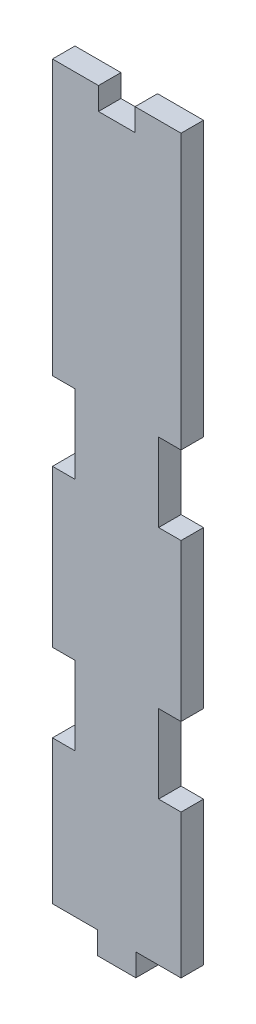
ISO-10303-21;
HEADER;
FILE_DESCRIPTION(('STEP AP214'),'2;1');
FILE_NAME('part.step','',(''),(''),'','','');
FILE_SCHEMA(('AUTOMOTIVE_DESIGN { 1 0 10303 214 1 1 1 1 }'));
ENDSEC;
DATA;
#1=APPLICATION_CONTEXT('core data for automotive mechanical design processes');
#2=APPLICATION_PROTOCOL_DEFINITION('international standard','automotive_design',2000,#1);
#3=PRODUCT_CONTEXT('',#1,'mechanical');
#4=PRODUCT('Part','Part','',(#3));
#5=PRODUCT_RELATED_PRODUCT_CATEGORY('part','',(#4));
#6=PRODUCT_DEFINITION_FORMATION('','',#4);
#7=PRODUCT_DEFINITION_CONTEXT('part definition',#1,'design');
#8=PRODUCT_DEFINITION('design','',#6,#7);
#9=PRODUCT_DEFINITION_SHAPE('','',#8);
#10=(LENGTH_UNIT() NAMED_UNIT(*) SI_UNIT(.MILLI.,.METRE.));
#11=(NAMED_UNIT(*) PLANE_ANGLE_UNIT() SI_UNIT($,.RADIAN.));
#12=(NAMED_UNIT(*) SI_UNIT($,.STERADIAN.) SOLID_ANGLE_UNIT());
#13=UNCERTAINTY_MEASURE_WITH_UNIT(LENGTH_MEASURE(1.E-05),#10,'distance_accuracy_value','');
#14=(GEOMETRIC_REPRESENTATION_CONTEXT(3) GLOBAL_UNCERTAINTY_ASSIGNED_CONTEXT((#13)) GLOBAL_UNIT_ASSIGNED_CONTEXT((#10,
#11,#12)) REPRESENTATION_CONTEXT('',''));
#15=CARTESIAN_POINT('',(0.,0.,0.));
#16=DIRECTION('',(0.,0.,1.));
#17=DIRECTION('',(1.,0.,0.));
#18=AXIS2_PLACEMENT_3D('',#15,#16,#17);
#19=CARTESIAN_POINT('',(12.3,17.5,4.3));
#20=DIRECTION('',(-1.,0.,0.));
#21=DIRECTION('',(0.,-1.,0.));
#22=AXIS2_PLACEMENT_3D('',#19,#20,#21);
#23=PLANE('',#22);
#24=DIRECTION('',(0.,1.,0.));
#25=VECTOR('',#24,1.);
#26=CARTESIAN_POINT('',(12.3,17.5,0.));
#27=LINE('',#26,#25);
#28=CARTESIAN_POINT('',(12.3,17.5,0.));
#29=VERTEX_POINT('',#28);
#30=CARTESIAN_POINT('',(12.3,69.9999999999999,0.));
#31=VERTEX_POINT('',#30);
#32=EDGE_CURVE('E252',#29,#31,#27,.T.);
#33=ORIENTED_EDGE('',*,*,#32,.T.);
#34=DIRECTION('',(0.,0.,-1.));
#35=VECTOR('',#34,1.);
#36=CARTESIAN_POINT('',(12.3,69.9999999999999,4.3));
#37=LINE('',#36,#35);
#38=CARTESIAN_POINT('',(12.3,69.9999999999999,4.3));
#39=VERTEX_POINT('',#38);
#40=EDGE_CURVE('E11',#39,#31,#37,.T.);
#41=ORIENTED_EDGE('',*,*,#40,.F.);
#42=DIRECTION('',(0.,1.,0.));
#43=VECTOR('',#42,1.);
#44=CARTESIAN_POINT('',(12.3,17.5,4.3));
#45=LINE('',#44,#43);
#46=CARTESIAN_POINT('',(12.3,17.5,4.3));
#47=VERTEX_POINT('',#46);
#48=EDGE_CURVE('E306',#47,#39,#45,.T.);
#49=ORIENTED_EDGE('',*,*,#48,.F.);
#50=DIRECTION('',(0.,0.,-1.));
#51=VECTOR('',#50,1.);
#52=CARTESIAN_POINT('',(12.3,17.5,4.3));
#53=LINE('',#52,#51);
#54=EDGE_CURVE('E248',#47,#29,#53,.T.);
#55=ORIENTED_EDGE('',*,*,#54,.T.);
#56=EDGE_LOOP('',(#33,#41,#49,#55));
#57=FACE_BOUND('',#56,.T.);
#58=ADVANCED_FACE('F36',(#57),#23,.F.);
#59=CARTESIAN_POINT('',(3.5,70.,4.3));
#60=DIRECTION('',(0.,-1.,0.));
#61=DIRECTION('',(1.,0.,0.));
#62=AXIS2_PLACEMENT_3D('',#59,#60,#61);
#63=PLANE('',#62);
#64=DIRECTION('',(-1.,0.,0.));
#65=VECTOR('',#64,1.);
#66=CARTESIAN_POINT('',(3.5,70.,0.));
#67=LINE('',#66,#65);
#68=CARTESIAN_POINT('',(3.5,70.,0.));
#69=VERTEX_POINT('',#68);
#70=EDGE_CURVE('E255',#31,#69,#67,.T.);
#71=ORIENTED_EDGE('',*,*,#70,.T.);
#72=DIRECTION('',(0.,0.,-1.));
#73=VECTOR('',#72,1.);
#74=CARTESIAN_POINT('',(3.5,70.,4.3));
#75=LINE('',#74,#73);
#76=CARTESIAN_POINT('',(3.5,70.,4.3));
#77=VERTEX_POINT('',#76);
#78=EDGE_CURVE('E44',#77,#69,#75,.T.);
#79=ORIENTED_EDGE('',*,*,#78,.F.);
#80=DIRECTION('',(-1.,0.,0.));
#81=VECTOR('',#80,1.);
#82=CARTESIAN_POINT('',(3.5,70.,4.3));
#83=LINE('',#82,#81);
#84=EDGE_CURVE('E155',#39,#77,#83,.T.);
#85=ORIENTED_EDGE('',*,*,#84,.F.);
#86=ORIENTED_EDGE('',*,*,#40,.T.);
#87=EDGE_LOOP('',(#71,#79,#85,#86));
#88=FACE_BOUND('',#87,.T.);
#89=ADVANCED_FACE('F464',(#88),#63,.F.);
#90=CARTESIAN_POINT('',(3.5,70.,4.3));
#91=DIRECTION('',(1.,0.,0.));
#92=DIRECTION('',(0.,0.,-1.));
#93=AXIS2_PLACEMENT_3D('',#90,#91,#92);
#94=PLANE('',#93);
#95=DIRECTION('',(0.,-1.,0.));
#96=VECTOR('',#95,1.);
#97=CARTESIAN_POINT('',(3.5,70.,0.));
#98=LINE('',#97,#96);
#99=CARTESIAN_POINT('',(3.5,65.7,0.));
#100=VERTEX_POINT('',#99);
#101=EDGE_CURVE('E257',#69,#100,#98,.T.);
#102=ORIENTED_EDGE('',*,*,#101,.T.);
#103=DIRECTION('',(0.,0.,-1.));
#104=VECTOR('',#103,1.);
#105=CARTESIAN_POINT('',(3.5,65.7,4.3));
#106=LINE('',#105,#104);
#107=CARTESIAN_POINT('',(3.5,65.7,4.3));
#108=VERTEX_POINT('',#107);
#109=EDGE_CURVE('E373',#108,#100,#106,.T.);
#110=ORIENTED_EDGE('',*,*,#109,.F.);
#111=DIRECTION('',(0.,-1.,0.));
#112=VECTOR('',#111,1.);
#113=CARTESIAN_POINT('',(3.5,70.,4.3));
#114=LINE('',#113,#112);
#115=EDGE_CURVE('E381',#77,#108,#114,.T.);
#116=ORIENTED_EDGE('',*,*,#115,.F.);
#117=ORIENTED_EDGE('',*,*,#78,.T.);
#118=EDGE_LOOP('',(#102,#110,#116,#117));
#119=FACE_BOUND('',#118,.T.);
#120=ADVANCED_FACE('F379',(#119),#94,.F.);
#121=CARTESIAN_POINT('',(-3.5,65.7,4.3));
#122=DIRECTION('',(0.,-1.,0.));
#123=DIRECTION('',(0.,0.,-1.));
#124=AXIS2_PLACEMENT_3D('',#121,#122,#123);
#125=PLANE('',#124);
#126=DIRECTION('',(-1.,0.,0.));
#127=VECTOR('',#126,1.);
#128=CARTESIAN_POINT('',(-3.5,65.7,0.));
#129=LINE('',#128,#127);
#130=CARTESIAN_POINT('',(-3.5,65.7,0.));
#131=VERTEX_POINT('',#130);
#132=EDGE_CURVE('E259',#100,#131,#129,.T.);
#133=ORIENTED_EDGE('',*,*,#132,.T.);
#134=DIRECTION('',(0.,0.,-1.));
#135=VECTOR('',#134,1.);
#136=CARTESIAN_POINT('',(-3.5,65.7,4.3));
#137=LINE('',#136,#135);
#138=CARTESIAN_POINT('',(-3.5,65.7,4.3));
#139=VERTEX_POINT('',#138);
#140=EDGE_CURVE('E370',#139,#131,#137,.T.);
#141=ORIENTED_EDGE('',*,*,#140,.F.);
#142=DIRECTION('',(-1.,0.,0.));
#143=VECTOR('',#142,1.);
#144=CARTESIAN_POINT('',(-3.5,65.7,4.3));
#145=LINE('',#144,#143);
#146=EDGE_CURVE('E399',#108,#139,#145,.T.);
#147=ORIENTED_EDGE('',*,*,#146,.F.);
#148=ORIENTED_EDGE('',*,*,#109,.T.);
#149=EDGE_LOOP('',(#133,#141,#147,#148));
#150=FACE_BOUND('',#149,.T.);
#151=ADVANCED_FACE('F390',(#150),#125,.F.);
#152=CARTESIAN_POINT('',(-3.5,70.,4.3));
#153=DIRECTION('',(-1.,0.,0.));
#154=DIRECTION('',(0.,-1.,0.));
#155=AXIS2_PLACEMENT_3D('',#152,#153,#154);
#156=PLANE('',#155);
#157=DIRECTION('',(0.,1.,0.));
#158=VECTOR('',#157,1.);
#159=CARTESIAN_POINT('',(-3.5,70.,0.));
#160=LINE('',#159,#158);
#161=CARTESIAN_POINT('',(-3.5,70.,0.));
#162=VERTEX_POINT('',#161);
#163=EDGE_CURVE('E261',#131,#162,#160,.T.);
#164=ORIENTED_EDGE('',*,*,#163,.T.);
#165=DIRECTION('',(0.,0.,-1.));
#166=VECTOR('',#165,1.);
#167=CARTESIAN_POINT('',(-3.5,70.,4.3));
#168=LINE('',#167,#166);
#169=CARTESIAN_POINT('',(-3.5,70.,4.3));
#170=VERTEX_POINT('',#169);
#171=EDGE_CURVE('E367',#170,#162,#168,.T.);
#172=ORIENTED_EDGE('',*,*,#171,.F.);
#173=DIRECTION('',(0.,1.,0.));
#174=VECTOR('',#173,1.);
#175=CARTESIAN_POINT('',(-3.5,70.,4.3));
#176=LINE('',#175,#174);
#177=EDGE_CURVE('E396',#139,#170,#176,.T.);
#178=ORIENTED_EDGE('',*,*,#177,.F.);
#179=ORIENTED_EDGE('',*,*,#140,.T.);
#180=EDGE_LOOP('',(#164,#172,#178,#179));
#181=FACE_BOUND('',#180,.T.);
#182=ADVANCED_FACE('F394',(#181),#156,.F.);
#183=CARTESIAN_POINT('',(-12.3,69.9999999999999,4.3));
#184=DIRECTION('',(0.,-1.,0.));
#185=DIRECTION('',(1.,0.,0.));
#186=AXIS2_PLACEMENT_3D('',#183,#184,#185);
#187=PLANE('',#186);
#188=DIRECTION('',(-1.,0.,0.));
#189=VECTOR('',#188,1.);
#190=CARTESIAN_POINT('',(-12.3,69.9999999999999,0.));
#191=LINE('',#190,#189);
#192=CARTESIAN_POINT('',(-12.3,69.9999999999999,0.));
#193=VERTEX_POINT('',#192);
#194=EDGE_CURVE('E263',#162,#193,#191,.T.);
#195=ORIENTED_EDGE('',*,*,#194,.T.);
#196=DIRECTION('',(0.,0.,-1.));
#197=VECTOR('',#196,1.);
#198=CARTESIAN_POINT('',(-12.3,69.9999999999999,4.3));
#199=LINE('',#198,#197);
#200=CARTESIAN_POINT('',(-12.3,69.9999999999999,4.3));
#201=VERTEX_POINT('',#200);
#202=EDGE_CURVE('E364',#201,#193,#199,.T.);
#203=ORIENTED_EDGE('',*,*,#202,.F.);
#204=DIRECTION('',(-1.,0.,0.));
#205=VECTOR('',#204,1.);
#206=CARTESIAN_POINT('',(-12.3,69.9999999999999,4.3));
#207=LINE('',#206,#205);
#208=EDGE_CURVE('E398',#170,#201,#207,.T.);
#209=ORIENTED_EDGE('',*,*,#208,.F.);
#210=ORIENTED_EDGE('',*,*,#171,.T.);
#211=EDGE_LOOP('',(#195,#203,#209,#210));
#212=FACE_BOUND('',#211,.T.);
#213=ADVANCED_FACE('F477',(#212),#187,.F.);
#214=CARTESIAN_POINT('',(-12.3,17.5,4.3));
#215=DIRECTION('',(1.,0.,0.));
#216=DIRECTION('',(0.,1.,0.));
#217=AXIS2_PLACEMENT_3D('',#214,#215,#216);
#218=PLANE('',#217);
#219=DIRECTION('',(0.,-1.,0.));
#220=VECTOR('',#219,1.);
#221=CARTESIAN_POINT('',(-12.3,17.5,0.));
#222=LINE('',#221,#220);
#223=CARTESIAN_POINT('',(-12.3,17.5,0.));
#224=VERTEX_POINT('',#223);
#225=EDGE_CURVE('E265',#193,#224,#222,.T.);
#226=ORIENTED_EDGE('',*,*,#225,.T.);
#227=DIRECTION('',(0.,0.,-1.));
#228=VECTOR('',#227,1.);
#229=CARTESIAN_POINT('',(-12.3,17.5,4.3));
#230=LINE('',#229,#228);
#231=CARTESIAN_POINT('',(-12.3,17.5,4.3));
#232=VERTEX_POINT('',#231);
#233=EDGE_CURVE('E361',#232,#224,#230,.T.);
#234=ORIENTED_EDGE('',*,*,#233,.F.);
#235=DIRECTION('',(0.,-1.,0.));
#236=VECTOR('',#235,1.);
#237=CARTESIAN_POINT('',(-12.3,17.5,4.3));
#238=LINE('',#237,#236);
#239=EDGE_CURVE('E401',#201,#232,#238,.T.);
#240=ORIENTED_EDGE('',*,*,#239,.F.);
#241=ORIENTED_EDGE('',*,*,#202,.T.);
#242=EDGE_LOOP('',(#226,#234,#240,#241));
#243=FACE_BOUND('',#242,.T.);
#244=ADVANCED_FACE('F480',(#243),#218,.F.);
#245=CARTESIAN_POINT('',(-12.3,17.5,4.3));
#246=DIRECTION('',(0.,1.,0.));
#247=DIRECTION('',(-1.,0.,0.));
#248=AXIS2_PLACEMENT_3D('',#245,#246,#247);
#249=PLANE('',#248);
#250=DIRECTION('',(1.,0.,0.));
#251=VECTOR('',#250,1.);
#252=CARTESIAN_POINT('',(-12.3,17.5,0.));
#253=LINE('',#252,#251);
#254=CARTESIAN_POINT('',(-8.,17.5,0.));
#255=VERTEX_POINT('',#254);
#256=EDGE_CURVE('E267',#224,#255,#253,.T.);
#257=ORIENTED_EDGE('',*,*,#256,.T.);
#258=DIRECTION('',(0.,0.,-1.));
#259=VECTOR('',#258,1.);
#260=CARTESIAN_POINT('',(-8.,17.5,4.3));
#261=LINE('',#260,#259);
#262=CARTESIAN_POINT('',(-8.,17.5,4.3));
#263=VERTEX_POINT('',#262);
#264=EDGE_CURVE('E358',#263,#255,#261,.T.);
#265=ORIENTED_EDGE('',*,*,#264,.F.);
#266=DIRECTION('',(1.,0.,0.));
#267=VECTOR('',#266,1.);
#268=CARTESIAN_POINT('',(-12.3,17.5,4.3));
#269=LINE('',#268,#267);
#270=EDGE_CURVE('E407',#232,#263,#269,.T.);
#271=ORIENTED_EDGE('',*,*,#270,.F.);
#272=ORIENTED_EDGE('',*,*,#233,.T.);
#273=EDGE_LOOP('',(#257,#265,#271,#272));
#274=FACE_BOUND('',#273,.T.);
#275=ADVANCED_FACE('F484',(#274),#249,.F.);
#276=CARTESIAN_POINT('',(-8.,17.5,4.3));
#277=DIRECTION('',(1.,0.,0.));
#278=DIRECTION('',(0.,1.,0.));
#279=AXIS2_PLACEMENT_3D('',#276,#277,#278);
#280=PLANE('',#279);
#281=DIRECTION('',(0.,-1.,0.));
#282=VECTOR('',#281,1.);
#283=CARTESIAN_POINT('',(-8.,17.5,0.));
#284=LINE('',#283,#282);
#285=CARTESIAN_POINT('',(-8.,2.50000000000001,0.));
#286=VERTEX_POINT('',#285);
#287=EDGE_CURVE('E269',#255,#286,#284,.T.);
#288=ORIENTED_EDGE('',*,*,#287,.T.);
#289=DIRECTION('',(0.,0.,-1.));
#290=VECTOR('',#289,1.);
#291=CARTESIAN_POINT('',(-8.,2.50000000000001,4.3));
#292=LINE('',#291,#290);
#293=CARTESIAN_POINT('',(-8.,2.50000000000001,4.3));
#294=VERTEX_POINT('',#293);
#295=EDGE_CURVE('E355',#294,#286,#292,.T.);
#296=ORIENTED_EDGE('',*,*,#295,.F.);
#297=DIRECTION('',(0.,-1.,0.));
#298=VECTOR('',#297,1.);
#299=CARTESIAN_POINT('',(-8.,17.5,4.3));
#300=LINE('',#299,#298);
#301=EDGE_CURVE('E409',#263,#294,#300,.T.);
#302=ORIENTED_EDGE('',*,*,#301,.F.);
#303=ORIENTED_EDGE('',*,*,#264,.T.);
#304=EDGE_LOOP('',(#288,#296,#302,#303));
#305=FACE_BOUND('',#304,.T.);
#306=ADVANCED_FACE('F488',(#305),#280,.F.);
#307=CARTESIAN_POINT('',(-12.3,2.49999999999999,4.3));
#308=DIRECTION('',(0.,-1.,0.));
#309=DIRECTION('',(1.,0.,0.));
#310=AXIS2_PLACEMENT_3D('',#307,#308,#309);
#311=PLANE('',#310);
#312=DIRECTION('',(-1.,0.,0.));
#313=VECTOR('',#312,1.);
#314=CARTESIAN_POINT('',(-12.3,2.49999999999999,0.));
#315=LINE('',#314,#313);
#316=CARTESIAN_POINT('',(-12.3,2.49999999999999,0.));
#317=VERTEX_POINT('',#316);
#318=EDGE_CURVE('E271',#286,#317,#315,.T.);
#319=ORIENTED_EDGE('',*,*,#318,.T.);
#320=DIRECTION('',(0.,0.,-1.));
#321=VECTOR('',#320,1.);
#322=CARTESIAN_POINT('',(-12.3,2.49999999999999,4.3));
#323=LINE('',#322,#321);
#324=CARTESIAN_POINT('',(-12.3,2.49999999999999,4.3));
#325=VERTEX_POINT('',#324);
#326=EDGE_CURVE('E352',#325,#317,#323,.T.);
#327=ORIENTED_EDGE('',*,*,#326,.F.);
#328=DIRECTION('',(-1.,0.,0.));
#329=VECTOR('',#328,1.);
#330=CARTESIAN_POINT('',(-12.3,2.49999999999999,4.3));
#331=LINE('',#330,#329);
#332=EDGE_CURVE('E411',#294,#325,#331,.T.);
#333=ORIENTED_EDGE('',*,*,#332,.F.);
#334=ORIENTED_EDGE('',*,*,#295,.T.);
#335=EDGE_LOOP('',(#319,#327,#333,#334));
#336=FACE_BOUND('',#335,.T.);
#337=ADVANCED_FACE('F492',(#336),#311,.F.);
#338=CARTESIAN_POINT('',(-12.3,-27.5,4.3));
#339=DIRECTION('',(1.,0.,0.));
#340=DIRECTION('',(0.,1.,0.));
#341=AXIS2_PLACEMENT_3D('',#338,#339,#340);
#342=PLANE('',#341);
#343=DIRECTION('',(0.,-1.,0.));
#344=VECTOR('',#343,1.);
#345=CARTESIAN_POINT('',(-12.3,-27.5,0.));
#346=LINE('',#345,#344);
#347=CARTESIAN_POINT('',(-12.3,-27.5,0.));
#348=VERTEX_POINT('',#347);
#349=EDGE_CURVE('E273',#317,#348,#346,.T.);
#350=ORIENTED_EDGE('',*,*,#349,.T.);
#351=DIRECTION('',(0.,0.,-1.));
#352=VECTOR('',#351,1.);
#353=CARTESIAN_POINT('',(-12.3,-27.5,4.3));
#354=LINE('',#353,#352);
#355=CARTESIAN_POINT('',(-12.3,-27.5,4.3));
#356=VERTEX_POINT('',#355);
#357=EDGE_CURVE('E349',#356,#348,#354,.T.);
#358=ORIENTED_EDGE('',*,*,#357,.F.);
#359=DIRECTION('',(0.,-1.,0.));
#360=VECTOR('',#359,1.);
#361=CARTESIAN_POINT('',(-12.3,-27.5,4.3));
#362=LINE('',#361,#360);
#363=EDGE_CURVE('E413',#325,#356,#362,.T.);
#364=ORIENTED_EDGE('',*,*,#363,.F.);
#365=ORIENTED_EDGE('',*,*,#326,.T.);
#366=EDGE_LOOP('',(#350,#358,#364,#365));
#367=FACE_BOUND('',#366,.T.);
#368=ADVANCED_FACE('F496',(#367),#342,.F.);
#369=CARTESIAN_POINT('',(-12.3,-27.5,4.3));
#370=DIRECTION('',(0.,1.,0.));
#371=DIRECTION('',(-1.,0.,0.));
#372=AXIS2_PLACEMENT_3D('',#369,#370,#371);
#373=PLANE('',#372);
#374=DIRECTION('',(1.,0.,0.));
#375=VECTOR('',#374,1.);
#376=CARTESIAN_POINT('',(-12.3,-27.5,0.));
#377=LINE('',#376,#375);
#378=CARTESIAN_POINT('',(-8.00000000000001,-27.4999999999999,0.));
#379=VERTEX_POINT('',#378);
#380=EDGE_CURVE('E275',#348,#379,#377,.T.);
#381=ORIENTED_EDGE('',*,*,#380,.T.);
#382=DIRECTION('',(0.,0.,-1.));
#383=VECTOR('',#382,1.);
#384=CARTESIAN_POINT('',(-8.00000000000001,-27.4999999999999,4.3));
#385=LINE('',#384,#383);
#386=CARTESIAN_POINT('',(-8.00000000000001,-27.4999999999999,4.3));
#387=VERTEX_POINT('',#386);
#388=EDGE_CURVE('E346',#387,#379,#385,.T.);
#389=ORIENTED_EDGE('',*,*,#388,.F.);
#390=DIRECTION('',(1.,0.,0.));
#391=VECTOR('',#390,1.);
#392=CARTESIAN_POINT('',(-12.3,-27.5,4.3));
#393=LINE('',#392,#391);
#394=EDGE_CURVE('E415',#356,#387,#393,.T.);
#395=ORIENTED_EDGE('',*,*,#394,.F.);
#396=ORIENTED_EDGE('',*,*,#357,.T.);
#397=EDGE_LOOP('',(#381,#389,#395,#396));
#398=FACE_BOUND('',#397,.T.);
#399=ADVANCED_FACE('F500',(#398),#373,.F.);
#400=CARTESIAN_POINT('',(-8.00000000000001,-27.4999999999999,4.3));
#401=DIRECTION('',(1.,0.,0.));
#402=DIRECTION('',(0.,1.,0.));
#403=AXIS2_PLACEMENT_3D('',#400,#401,#402);
#404=PLANE('',#403);
#405=DIRECTION('',(0.,-1.,0.));
#406=VECTOR('',#405,1.);
#407=CARTESIAN_POINT('',(-8.00000000000001,-27.4999999999999,0.));
#408=LINE('',#407,#406);
#409=CARTESIAN_POINT('',(-8.00000000000001,-42.4999999999999,0.));
#410=VERTEX_POINT('',#409);
#411=EDGE_CURVE('E277',#379,#410,#408,.T.);
#412=ORIENTED_EDGE('',*,*,#411,.T.);
#413=DIRECTION('',(0.,0.,-1.));
#414=VECTOR('',#413,1.);
#415=CARTESIAN_POINT('',(-8.00000000000001,-42.4999999999999,4.3));
#416=LINE('',#415,#414);
#417=CARTESIAN_POINT('',(-8.00000000000001,-42.4999999999999,4.3));
#418=VERTEX_POINT('',#417);
#419=EDGE_CURVE('E343',#418,#410,#416,.T.);
#420=ORIENTED_EDGE('',*,*,#419,.F.);
#421=DIRECTION('',(0.,-1.,0.));
#422=VECTOR('',#421,1.);
#423=CARTESIAN_POINT('',(-8.00000000000001,-27.4999999999999,4.3));
#424=LINE('',#423,#422);
#425=EDGE_CURVE('E417',#387,#418,#424,.T.);
#426=ORIENTED_EDGE('',*,*,#425,.F.);
#427=ORIENTED_EDGE('',*,*,#388,.T.);
#428=EDGE_LOOP('',(#412,#420,#426,#427));
#429=FACE_BOUND('',#428,.T.);
#430=ADVANCED_FACE('F504',(#429),#404,.F.);
#431=CARTESIAN_POINT('',(-12.3,-42.5,4.3));
#432=DIRECTION('',(0.,-1.,0.));
#433=DIRECTION('',(1.,0.,0.));
#434=AXIS2_PLACEMENT_3D('',#431,#432,#433);
#435=PLANE('',#434);
#436=DIRECTION('',(-1.,0.,0.));
#437=VECTOR('',#436,1.);
#438=CARTESIAN_POINT('',(-12.3,-42.5,0.));
#439=LINE('',#438,#437);
#440=CARTESIAN_POINT('',(-12.3,-42.5,0.));
#441=VERTEX_POINT('',#440);
#442=EDGE_CURVE('E279',#410,#441,#439,.T.);
#443=ORIENTED_EDGE('',*,*,#442,.T.);
#444=DIRECTION('',(0.,0.,-1.));
#445=VECTOR('',#444,1.);
#446=CARTESIAN_POINT('',(-12.3,-42.5,4.3));
#447=LINE('',#446,#445);
#448=CARTESIAN_POINT('',(-12.3,-42.5,4.3));
#449=VERTEX_POINT('',#448);
#450=EDGE_CURVE('E340',#449,#441,#447,.T.);
#451=ORIENTED_EDGE('',*,*,#450,.F.);
#452=DIRECTION('',(-1.,0.,0.));
#453=VECTOR('',#452,1.);
#454=CARTESIAN_POINT('',(-12.3,-42.5,4.3));
#455=LINE('',#454,#453);
#456=EDGE_CURVE('E419',#418,#449,#455,.T.);
#457=ORIENTED_EDGE('',*,*,#456,.F.);
#458=ORIENTED_EDGE('',*,*,#419,.T.);
#459=EDGE_LOOP('',(#443,#451,#457,#458));
#460=FACE_BOUND('',#459,.T.);
#461=ADVANCED_FACE('F508',(#460),#435,.F.);
#462=CARTESIAN_POINT('',(-12.3,-70.0000000000001,4.3));
#463=DIRECTION('',(1.,0.,0.));
#464=DIRECTION('',(0.,1.,0.));
#465=AXIS2_PLACEMENT_3D('',#462,#463,#464);
#466=PLANE('',#465);
#467=DIRECTION('',(0.,-1.,0.));
#468=VECTOR('',#467,1.);
#469=CARTESIAN_POINT('',(-12.3,-70.0000000000001,0.));
#470=LINE('',#469,#468);
#471=CARTESIAN_POINT('',(-12.3,-70.0000000000001,0.));
#472=VERTEX_POINT('',#471);
#473=EDGE_CURVE('E281',#441,#472,#470,.T.);
#474=ORIENTED_EDGE('',*,*,#473,.T.);
#475=DIRECTION('',(0.,0.,-1.));
#476=VECTOR('',#475,1.);
#477=CARTESIAN_POINT('',(-12.3,-70.0000000000001,4.3));
#478=LINE('',#477,#476);
#479=CARTESIAN_POINT('',(-12.3,-70.0000000000001,4.3));
#480=VERTEX_POINT('',#479);
#481=EDGE_CURVE('E337',#480,#472,#478,.T.);
#482=ORIENTED_EDGE('',*,*,#481,.F.);
#483=DIRECTION('',(0.,-1.,0.));
#484=VECTOR('',#483,1.);
#485=CARTESIAN_POINT('',(-12.3,-70.0000000000001,4.3));
#486=LINE('',#485,#484);
#487=EDGE_CURVE('E421',#449,#480,#486,.T.);
#488=ORIENTED_EDGE('',*,*,#487,.F.);
#489=ORIENTED_EDGE('',*,*,#450,.T.);
#490=EDGE_LOOP('',(#474,#482,#488,#489));
#491=FACE_BOUND('',#490,.T.);
#492=ADVANCED_FACE('F512',(#491),#466,.F.);
#493=CARTESIAN_POINT('',(-12.3,-70.0000000000001,4.3));
#494=DIRECTION('',(0.,1.,0.));
#495=DIRECTION('',(-1.,0.,0.));
#496=AXIS2_PLACEMENT_3D('',#493,#494,#495);
#497=PLANE('',#496);
#498=DIRECTION('',(1.,0.,0.));
#499=VECTOR('',#498,1.);
#500=CARTESIAN_POINT('',(-12.3,-70.0000000000001,0.));
#501=LINE('',#500,#499);
#502=CARTESIAN_POINT('',(-3.65,-70.,0.));
#503=VERTEX_POINT('',#502);
#504=EDGE_CURVE('E283',#472,#503,#501,.T.);
#505=ORIENTED_EDGE('',*,*,#504,.T.);
#506=DIRECTION('',(0.,0.,-1.));
#507=VECTOR('',#506,1.);
#508=CARTESIAN_POINT('',(-3.65,-70.,4.3));
#509=LINE('',#508,#507);
#510=CARTESIAN_POINT('',(-3.65,-70.,4.3));
#511=VERTEX_POINT('',#510);
#512=EDGE_CURVE('E334',#511,#503,#509,.T.);
#513=ORIENTED_EDGE('',*,*,#512,.F.);
#514=DIRECTION('',(1.,0.,0.));
#515=VECTOR('',#514,1.);
#516=CARTESIAN_POINT('',(-12.3,-70.0000000000001,4.3));
#517=LINE('',#516,#515);
#518=EDGE_CURVE('E423',#480,#511,#517,.T.);
#519=ORIENTED_EDGE('',*,*,#518,.F.);
#520=ORIENTED_EDGE('',*,*,#481,.T.);
#521=EDGE_LOOP('',(#505,#513,#519,#520));
#522=FACE_BOUND('',#521,.T.);
#523=ADVANCED_FACE('F516',(#522),#497,.F.);
#524=CARTESIAN_POINT('',(-3.65,-70.,4.3));
#525=DIRECTION('',(1.,0.,0.));
#526=DIRECTION('',(0.,1.,0.));
#527=AXIS2_PLACEMENT_3D('',#524,#525,#526);
#528=PLANE('',#527);
#529=DIRECTION('',(0.,-1.,0.));
#530=VECTOR('',#529,1.);
#531=CARTESIAN_POINT('',(-3.65,-70.,0.));
#532=LINE('',#531,#530);
#533=CARTESIAN_POINT('',(-3.65,-74.3,0.));
#534=VERTEX_POINT('',#533);
#535=EDGE_CURVE('E285',#503,#534,#532,.T.);
#536=ORIENTED_EDGE('',*,*,#535,.T.);
#537=DIRECTION('',(0.,0.,-1.));
#538=VECTOR('',#537,1.);
#539=CARTESIAN_POINT('',(-3.65,-74.3,4.3));
#540=LINE('',#539,#538);
#541=CARTESIAN_POINT('',(-3.65,-74.3,4.3));
#542=VERTEX_POINT('',#541);
#543=EDGE_CURVE('E331',#542,#534,#540,.T.);
#544=ORIENTED_EDGE('',*,*,#543,.F.);
#545=DIRECTION('',(0.,-1.,0.));
#546=VECTOR('',#545,1.);
#547=CARTESIAN_POINT('',(-3.65,-70.,4.3));
#548=LINE('',#547,#546);
#549=EDGE_CURVE('E425',#511,#542,#548,.T.);
#550=ORIENTED_EDGE('',*,*,#549,.F.);
#551=ORIENTED_EDGE('',*,*,#512,.T.);
#552=EDGE_LOOP('',(#536,#544,#550,#551));
#553=FACE_BOUND('',#552,.T.);
#554=ADVANCED_FACE('F520',(#553),#528,.F.);
#555=CARTESIAN_POINT('',(-3.65,-74.3,4.3));
#556=DIRECTION('',(0.,1.,0.));
#557=DIRECTION('',(0.,0.,1.));
#558=AXIS2_PLACEMENT_3D('',#555,#556,#557);
#559=PLANE('',#558);
#560=DIRECTION('',(1.,0.,0.));
#561=VECTOR('',#560,1.);
#562=CARTESIAN_POINT('',(-3.65,-74.3,0.));
#563=LINE('',#562,#561);
#564=CARTESIAN_POINT('',(3.65,-74.3,0.));
#565=VERTEX_POINT('',#564);
#566=EDGE_CURVE('E287',#534,#565,#563,.T.);
#567=ORIENTED_EDGE('',*,*,#566,.T.);
#568=DIRECTION('',(0.,0.,-1.));
#569=VECTOR('',#568,1.);
#570=CARTESIAN_POINT('',(3.65,-74.3,4.3));
#571=LINE('',#570,#569);
#572=CARTESIAN_POINT('',(3.65,-74.3,4.3));
#573=VERTEX_POINT('',#572);
#574=EDGE_CURVE('E328',#573,#565,#571,.T.);
#575=ORIENTED_EDGE('',*,*,#574,.F.);
#576=DIRECTION('',(1.,0.,0.));
#577=VECTOR('',#576,1.);
#578=CARTESIAN_POINT('',(-3.65,-74.3,4.3));
#579=LINE('',#578,#577);
#580=EDGE_CURVE('E427',#542,#573,#579,.T.);
#581=ORIENTED_EDGE('',*,*,#580,.F.);
#582=ORIENTED_EDGE('',*,*,#543,.T.);
#583=EDGE_LOOP('',(#567,#575,#581,#582));
#584=FACE_BOUND('',#583,.T.);
#585=ADVANCED_FACE('F524',(#584),#559,.F.);
#586=CARTESIAN_POINT('',(3.65,-70.,4.3));
#587=DIRECTION('',(-1.,0.,0.));
#588=DIRECTION('',(0.,-1.,0.));
#589=AXIS2_PLACEMENT_3D('',#586,#587,#588);
#590=PLANE('',#589);
#591=DIRECTION('',(0.,1.,0.));
#592=VECTOR('',#591,1.);
#593=CARTESIAN_POINT('',(3.65,-70.,0.));
#594=LINE('',#593,#592);
#595=CARTESIAN_POINT('',(3.65,-70.,0.));
#596=VERTEX_POINT('',#595);
#597=EDGE_CURVE('E289',#565,#596,#594,.T.);
#598=ORIENTED_EDGE('',*,*,#597,.T.);
#599=DIRECTION('',(0.,0.,-1.));
#600=VECTOR('',#599,1.);
#601=CARTESIAN_POINT('',(3.65,-70.,4.3));
#602=LINE('',#601,#600);
#603=CARTESIAN_POINT('',(3.65,-70.,4.3));
#604=VERTEX_POINT('',#603);
#605=EDGE_CURVE('E325',#604,#596,#602,.T.);
#606=ORIENTED_EDGE('',*,*,#605,.F.);
#607=DIRECTION('',(0.,1.,0.));
#608=VECTOR('',#607,1.);
#609=CARTESIAN_POINT('',(3.65,-70.,4.3));
#610=LINE('',#609,#608);
#611=EDGE_CURVE('E429',#573,#604,#610,.T.);
#612=ORIENTED_EDGE('',*,*,#611,.F.);
#613=ORIENTED_EDGE('',*,*,#574,.T.);
#614=EDGE_LOOP('',(#598,#606,#612,#613));
#615=FACE_BOUND('',#614,.T.);
#616=ADVANCED_FACE('F528',(#615),#590,.F.);
#617=CARTESIAN_POINT('',(3.65,-70.,4.3));
#618=DIRECTION('',(0.,1.,0.));
#619=DIRECTION('',(-1.,0.,0.));
#620=AXIS2_PLACEMENT_3D('',#617,#618,#619);
#621=PLANE('',#620);
#622=DIRECTION('',(1.,0.,0.));
#623=VECTOR('',#622,1.);
#624=CARTESIAN_POINT('',(3.65,-70.,0.));
#625=LINE('',#624,#623);
#626=CARTESIAN_POINT('',(12.3,-70.0000000000001,0.));
#627=VERTEX_POINT('',#626);
#628=EDGE_CURVE('E291',#596,#627,#625,.T.);
#629=ORIENTED_EDGE('',*,*,#628,.T.);
#630=DIRECTION('',(0.,0.,-1.));
#631=VECTOR('',#630,1.);
#632=CARTESIAN_POINT('',(12.3,-70.0000000000001,4.3));
#633=LINE('',#632,#631);
#634=CARTESIAN_POINT('',(12.3,-70.0000000000001,4.3));
#635=VERTEX_POINT('',#634);
#636=EDGE_CURVE('E322',#635,#627,#633,.T.);
#637=ORIENTED_EDGE('',*,*,#636,.F.);
#638=DIRECTION('',(1.,0.,0.));
#639=VECTOR('',#638,1.);
#640=CARTESIAN_POINT('',(3.65,-70.,4.3));
#641=LINE('',#640,#639);
#642=EDGE_CURVE('E431',#604,#635,#641,.T.);
#643=ORIENTED_EDGE('',*,*,#642,.F.);
#644=ORIENTED_EDGE('',*,*,#605,.T.);
#645=EDGE_LOOP('',(#629,#637,#643,#644));
#646=FACE_BOUND('',#645,.T.);
#647=ADVANCED_FACE('F532',(#646),#621,.F.);
#648=CARTESIAN_POINT('',(12.3,-70.0000000000001,4.3));
#649=DIRECTION('',(-1.,0.,0.));
#650=DIRECTION('',(0.,-1.,0.));
#651=AXIS2_PLACEMENT_3D('',#648,#649,#650);
#652=PLANE('',#651);
#653=DIRECTION('',(0.,1.,0.));
#654=VECTOR('',#653,1.);
#655=CARTESIAN_POINT('',(12.3,-70.0000000000001,0.));
#656=LINE('',#655,#654);
#657=CARTESIAN_POINT('',(12.3,-42.5,0.));
#658=VERTEX_POINT('',#657);
#659=EDGE_CURVE('E293',#627,#658,#656,.T.);
#660=ORIENTED_EDGE('',*,*,#659,.T.);
#661=DIRECTION('',(0.,0.,-1.));
#662=VECTOR('',#661,1.);
#663=CARTESIAN_POINT('',(12.3,-42.5,4.3));
#664=LINE('',#663,#662);
#665=CARTESIAN_POINT('',(12.3,-42.5,4.3));
#666=VERTEX_POINT('',#665);
#667=EDGE_CURVE('E319',#666,#658,#664,.T.);
#668=ORIENTED_EDGE('',*,*,#667,.F.);
#669=DIRECTION('',(0.,1.,0.));
#670=VECTOR('',#669,1.);
#671=CARTESIAN_POINT('',(12.3,-70.0000000000001,4.3));
#672=LINE('',#671,#670);
#673=EDGE_CURVE('E433',#635,#666,#672,.T.);
#674=ORIENTED_EDGE('',*,*,#673,.F.);
#675=ORIENTED_EDGE('',*,*,#636,.T.);
#676=EDGE_LOOP('',(#660,#668,#674,#675));
#677=FACE_BOUND('',#676,.T.);
#678=ADVANCED_FACE('F536',(#677),#652,.F.);
#679=CARTESIAN_POINT('',(12.3,-42.5,4.3));
#680=DIRECTION('',(0.,-1.,0.));
#681=DIRECTION('',(1.,0.,0.));
#682=AXIS2_PLACEMENT_3D('',#679,#680,#681);
#683=PLANE('',#682);
#684=DIRECTION('',(-1.,0.,0.));
#685=VECTOR('',#684,1.);
#686=CARTESIAN_POINT('',(12.3,-42.5,0.));
#687=LINE('',#686,#685);
#688=CARTESIAN_POINT('',(8.00000000000001,-42.4999999999999,0.));
#689=VERTEX_POINT('',#688);
#690=EDGE_CURVE('E295',#658,#689,#687,.T.);
#691=ORIENTED_EDGE('',*,*,#690,.T.);
#692=DIRECTION('',(0.,0.,-1.));
#693=VECTOR('',#692,1.);
#694=CARTESIAN_POINT('',(8.00000000000001,-42.4999999999999,4.3));
#695=LINE('',#694,#693);
#696=CARTESIAN_POINT('',(8.00000000000001,-42.4999999999999,4.3));
#697=VERTEX_POINT('',#696);
#698=EDGE_CURVE('E316',#697,#689,#695,.T.);
#699=ORIENTED_EDGE('',*,*,#698,.F.);
#700=DIRECTION('',(-1.,0.,0.));
#701=VECTOR('',#700,1.);
#702=CARTESIAN_POINT('',(12.3,-42.5,4.3));
#703=LINE('',#702,#701);
#704=EDGE_CURVE('E435',#666,#697,#703,.T.);
#705=ORIENTED_EDGE('',*,*,#704,.F.);
#706=ORIENTED_EDGE('',*,*,#667,.T.);
#707=EDGE_LOOP('',(#691,#699,#705,#706));
#708=FACE_BOUND('',#707,.T.);
#709=ADVANCED_FACE('F540',(#708),#683,.F.);
#710=CARTESIAN_POINT('',(8.00000000000001,-27.4999999999999,4.3));
#711=DIRECTION('',(-1.,0.,0.));
#712=DIRECTION('',(0.,-1.,0.));
#713=AXIS2_PLACEMENT_3D('',#710,#711,#712);
#714=PLANE('',#713);
#715=DIRECTION('',(0.,1.,0.));
#716=VECTOR('',#715,1.);
#717=CARTESIAN_POINT('',(8.00000000000001,-27.4999999999999,0.));
#718=LINE('',#717,#716);
#719=CARTESIAN_POINT('',(8.00000000000001,-27.4999999999999,0.));
#720=VERTEX_POINT('',#719);
#721=EDGE_CURVE('E297',#689,#720,#718,.T.);
#722=ORIENTED_EDGE('',*,*,#721,.T.);
#723=DIRECTION('',(0.,0.,-1.));
#724=VECTOR('',#723,1.);
#725=CARTESIAN_POINT('',(8.00000000000001,-27.4999999999999,4.3));
#726=LINE('',#725,#724);
#727=CARTESIAN_POINT('',(8.00000000000001,-27.4999999999999,4.3));
#728=VERTEX_POINT('',#727);
#729=EDGE_CURVE('E313',#728,#720,#726,.T.);
#730=ORIENTED_EDGE('',*,*,#729,.F.);
#731=DIRECTION('',(0.,1.,0.));
#732=VECTOR('',#731,1.);
#733=CARTESIAN_POINT('',(8.00000000000001,-27.4999999999999,4.3));
#734=LINE('',#733,#732);
#735=EDGE_CURVE('E437',#697,#728,#734,.T.);
#736=ORIENTED_EDGE('',*,*,#735,.F.);
#737=ORIENTED_EDGE('',*,*,#698,.T.);
#738=EDGE_LOOP('',(#722,#730,#736,#737));
#739=FACE_BOUND('',#738,.T.);
#740=ADVANCED_FACE('F544',(#739),#714,.F.);
#741=CARTESIAN_POINT('',(12.3,-27.5,4.3));
#742=DIRECTION('',(0.,1.,0.));
#743=DIRECTION('',(-1.,0.,0.));
#744=AXIS2_PLACEMENT_3D('',#741,#742,#743);
#745=PLANE('',#744);
#746=DIRECTION('',(1.,0.,0.));
#747=VECTOR('',#746,1.);
#748=CARTESIAN_POINT('',(12.3,-27.5,0.));
#749=LINE('',#748,#747);
#750=CARTESIAN_POINT('',(12.3,-27.5,0.));
#751=VERTEX_POINT('',#750);
#752=EDGE_CURVE('E299',#720,#751,#749,.T.);
#753=ORIENTED_EDGE('',*,*,#752,.T.);
#754=DIRECTION('',(0.,0.,-1.));
#755=VECTOR('',#754,1.);
#756=CARTESIAN_POINT('',(12.3,-27.5,4.3));
#757=LINE('',#756,#755);
#758=CARTESIAN_POINT('',(12.3,-27.5,4.3));
#759=VERTEX_POINT('',#758);
#760=EDGE_CURVE('E310',#759,#751,#757,.T.);
#761=ORIENTED_EDGE('',*,*,#760,.F.);
#762=DIRECTION('',(1.,0.,0.));
#763=VECTOR('',#762,1.);
#764=CARTESIAN_POINT('',(12.3,-27.5,4.3));
#765=LINE('',#764,#763);
#766=EDGE_CURVE('E439',#728,#759,#765,.T.);
#767=ORIENTED_EDGE('',*,*,#766,.F.);
#768=ORIENTED_EDGE('',*,*,#729,.T.);
#769=EDGE_LOOP('',(#753,#761,#767,#768));
#770=FACE_BOUND('',#769,.T.);
#771=ADVANCED_FACE('F445',(#770),#745,.F.);
#772=CARTESIAN_POINT('',(12.3,-27.5,4.3));
#773=DIRECTION('',(-1.,0.,0.));
#774=DIRECTION('',(0.,-1.,0.));
#775=AXIS2_PLACEMENT_3D('',#772,#773,#774);
#776=PLANE('',#775);
#777=DIRECTION('',(0.,1.,0.));
#778=VECTOR('',#777,1.);
#779=CARTESIAN_POINT('',(12.3,-27.5,0.));
#780=LINE('',#779,#778);
#781=CARTESIAN_POINT('',(12.3,2.49999999999999,0.));
#782=VERTEX_POINT('',#781);
#783=EDGE_CURVE('E301',#751,#782,#780,.T.);
#784=ORIENTED_EDGE('',*,*,#783,.T.);
#785=DIRECTION('',(0.,0.,-1.));
#786=VECTOR('',#785,1.);
#787=CARTESIAN_POINT('',(12.3,2.49999999999999,4.3));
#788=LINE('',#787,#786);
#789=CARTESIAN_POINT('',(12.3,2.49999999999999,4.3));
#790=VERTEX_POINT('',#789);
#791=EDGE_CURVE('E243',#790,#782,#788,.T.);
#792=ORIENTED_EDGE('',*,*,#791,.F.);
#793=DIRECTION('',(0.,1.,0.));
#794=VECTOR('',#793,1.);
#795=CARTESIAN_POINT('',(12.3,-27.5,4.3));
#796=LINE('',#795,#794);
#797=EDGE_CURVE('E234',#759,#790,#796,.T.);
#798=ORIENTED_EDGE('',*,*,#797,.F.);
#799=ORIENTED_EDGE('',*,*,#760,.T.);
#800=EDGE_LOOP('',(#784,#792,#798,#799));
#801=FACE_BOUND('',#800,.T.);
#802=ADVANCED_FACE('F449',(#801),#776,.F.);
#803=CARTESIAN_POINT('',(12.3,2.49999999999999,4.3));
#804=DIRECTION('',(0.,-1.,0.));
#805=DIRECTION('',(1.,0.,0.));
#806=AXIS2_PLACEMENT_3D('',#803,#804,#805);
#807=PLANE('',#806);
#808=DIRECTION('',(-1.,0.,0.));
#809=VECTOR('',#808,1.);
#810=CARTESIAN_POINT('',(12.3,2.49999999999999,0.));
#811=LINE('',#810,#809);
#812=CARTESIAN_POINT('',(8.,2.50000000000001,0.));
#813=VERTEX_POINT('',#812);
#814=EDGE_CURVE('E242',#782,#813,#811,.T.);
#815=ORIENTED_EDGE('',*,*,#814,.T.);
#816=DIRECTION('',(0.,0.,-1.));
#817=VECTOR('',#816,1.);
#818=CARTESIAN_POINT('',(8.,2.50000000000001,4.3));
#819=LINE('',#818,#817);
#820=CARTESIAN_POINT('',(8.,2.50000000000001,4.3));
#821=VERTEX_POINT('',#820);
#822=EDGE_CURVE('E239',#821,#813,#819,.T.);
#823=ORIENTED_EDGE('',*,*,#822,.F.);
#824=DIRECTION('',(-1.,0.,0.));
#825=VECTOR('',#824,1.);
#826=CARTESIAN_POINT('',(12.3,2.49999999999999,4.3));
#827=LINE('',#826,#825);
#828=EDGE_CURVE('E228',#790,#821,#827,.T.);
#829=ORIENTED_EDGE('',*,*,#828,.F.);
#830=ORIENTED_EDGE('',*,*,#791,.T.);
#831=EDGE_LOOP('',(#815,#823,#829,#830));
#832=FACE_BOUND('',#831,.T.);
#833=ADVANCED_FACE('F240',(#832),#807,.F.);
#834=CARTESIAN_POINT('',(8.,17.5,4.3));
#835=DIRECTION('',(-1.,0.,0.));
#836=DIRECTION('',(0.,-1.,0.));
#837=AXIS2_PLACEMENT_3D('',#834,#835,#836);
#838=PLANE('',#837);
#839=DIRECTION('',(0.,1.,0.));
#840=VECTOR('',#839,1.);
#841=CARTESIAN_POINT('',(8.,17.5,0.));
#842=LINE('',#841,#840);
#843=CARTESIAN_POINT('',(8.,17.5,0.));
#844=VERTEX_POINT('',#843);
#845=EDGE_CURVE('E141',#813,#844,#842,.T.);
#846=ORIENTED_EDGE('',*,*,#845,.T.);
#847=DIRECTION('',(0.,0.,-1.));
#848=VECTOR('',#847,1.);
#849=CARTESIAN_POINT('',(8.,17.5,4.3));
#850=LINE('',#849,#848);
#851=CARTESIAN_POINT('',(8.,17.5,4.3));
#852=VERTEX_POINT('',#851);
#853=EDGE_CURVE('E244',#852,#844,#850,.T.);
#854=ORIENTED_EDGE('',*,*,#853,.F.);
#855=DIRECTION('',(0.,1.,0.));
#856=VECTOR('',#855,1.);
#857=CARTESIAN_POINT('',(8.,17.5,4.3));
#858=LINE('',#857,#856);
#859=EDGE_CURVE('E232',#821,#852,#858,.T.);
#860=ORIENTED_EDGE('',*,*,#859,.F.);
#861=ORIENTED_EDGE('',*,*,#822,.T.);
#862=EDGE_LOOP('',(#846,#854,#860,#861));
#863=FACE_BOUND('',#862,.T.);
#864=ADVANCED_FACE('F246',(#863),#838,.F.);
#865=CARTESIAN_POINT('',(12.3,17.5,4.3));
#866=DIRECTION('',(0.,1.,0.));
#867=DIRECTION('',(-1.,0.,0.));
#868=AXIS2_PLACEMENT_3D('',#865,#866,#867);
#869=PLANE('',#868);
#870=DIRECTION('',(1.,0.,0.));
#871=VECTOR('',#870,1.);
#872=CARTESIAN_POINT('',(12.3,17.5,0.));
#873=LINE('',#872,#871);
#874=EDGE_CURVE('E147',#844,#29,#873,.T.);
#875=ORIENTED_EDGE('',*,*,#874,.T.);
#876=ORIENTED_EDGE('',*,*,#54,.F.);
#877=DIRECTION('',(1.,0.,0.));
#878=VECTOR('',#877,1.);
#879=CARTESIAN_POINT('',(12.3,17.5,4.3));
#880=LINE('',#879,#878);
#881=EDGE_CURVE('E52',#852,#47,#880,.T.);
#882=ORIENTED_EDGE('',*,*,#881,.F.);
#883=ORIENTED_EDGE('',*,*,#853,.T.);
#884=EDGE_LOOP('',(#875,#876,#882,#883));
#885=FACE_BOUND('',#884,.T.);
#886=ADVANCED_FACE('F453',(#885),#869,.F.);
#887=CARTESIAN_POINT('',(0.,0.,4.3));
#888=DIRECTION('',(0.,0.,-1.));
#889=DIRECTION('',(-1.,0.,0.));
#890=AXIS2_PLACEMENT_3D('',#887,#888,#889);
#891=PLANE('',#890);
#892=ORIENTED_EDGE('',*,*,#48,.T.);
#893=ORIENTED_EDGE('',*,*,#84,.T.);
#894=ORIENTED_EDGE('',*,*,#115,.T.);
#895=ORIENTED_EDGE('',*,*,#146,.T.);
#896=ORIENTED_EDGE('',*,*,#177,.T.);
#897=ORIENTED_EDGE('',*,*,#208,.T.);
#898=ORIENTED_EDGE('',*,*,#239,.T.);
#899=ORIENTED_EDGE('',*,*,#270,.T.);
#900=ORIENTED_EDGE('',*,*,#301,.T.);
#901=ORIENTED_EDGE('',*,*,#332,.T.);
#902=ORIENTED_EDGE('',*,*,#363,.T.);
#903=ORIENTED_EDGE('',*,*,#394,.T.);
#904=ORIENTED_EDGE('',*,*,#425,.T.);
#905=ORIENTED_EDGE('',*,*,#456,.T.);
#906=ORIENTED_EDGE('',*,*,#487,.T.);
#907=ORIENTED_EDGE('',*,*,#518,.T.);
#908=ORIENTED_EDGE('',*,*,#549,.T.);
#909=ORIENTED_EDGE('',*,*,#580,.T.);
#910=ORIENTED_EDGE('',*,*,#611,.T.);
#911=ORIENTED_EDGE('',*,*,#642,.T.);
#912=ORIENTED_EDGE('',*,*,#673,.T.);
#913=ORIENTED_EDGE('',*,*,#704,.T.);
#914=ORIENTED_EDGE('',*,*,#735,.T.);
#915=ORIENTED_EDGE('',*,*,#766,.T.);
#916=ORIENTED_EDGE('',*,*,#797,.T.);
#917=ORIENTED_EDGE('',*,*,#828,.T.);
#918=ORIENTED_EDGE('',*,*,#859,.T.);
#919=ORIENTED_EDGE('',*,*,#881,.T.);
#920=EDGE_LOOP('',(#892,#893,#894,#895,#896,#897,#898,#899,#900,#901,#902,#903,#904,#905,#906,
#907,#908,#909,#910,#911,#912,#913,#914,#915,#916,#917,#918,#919));
#921=FACE_BOUND('',#920,.T.);
#922=ADVANCED_FACE('F230',(#921),#891,.F.);
#923=CARTESIAN_POINT('',(0.,0.,0.));
#924=DIRECTION('',(0.,0.,-1.));
#925=DIRECTION('',(-1.,0.,0.));
#926=AXIS2_PLACEMENT_3D('',#923,#924,#925);
#927=PLANE('',#926);
#928=ORIENTED_EDGE('',*,*,#32,.F.);
#929=ORIENTED_EDGE('',*,*,#874,.F.);
#930=ORIENTED_EDGE('',*,*,#845,.F.);
#931=ORIENTED_EDGE('',*,*,#814,.F.);
#932=ORIENTED_EDGE('',*,*,#783,.F.);
#933=ORIENTED_EDGE('',*,*,#752,.F.);
#934=ORIENTED_EDGE('',*,*,#721,.F.);
#935=ORIENTED_EDGE('',*,*,#690,.F.);
#936=ORIENTED_EDGE('',*,*,#659,.F.);
#937=ORIENTED_EDGE('',*,*,#628,.F.);
#938=ORIENTED_EDGE('',*,*,#597,.F.);
#939=ORIENTED_EDGE('',*,*,#566,.F.);
#940=ORIENTED_EDGE('',*,*,#535,.F.);
#941=ORIENTED_EDGE('',*,*,#504,.F.);
#942=ORIENTED_EDGE('',*,*,#473,.F.);
#943=ORIENTED_EDGE('',*,*,#442,.F.);
#944=ORIENTED_EDGE('',*,*,#411,.F.);
#945=ORIENTED_EDGE('',*,*,#380,.F.);
#946=ORIENTED_EDGE('',*,*,#349,.F.);
#947=ORIENTED_EDGE('',*,*,#318,.F.);
#948=ORIENTED_EDGE('',*,*,#287,.F.);
#949=ORIENTED_EDGE('',*,*,#256,.F.);
#950=ORIENTED_EDGE('',*,*,#225,.F.);
#951=ORIENTED_EDGE('',*,*,#194,.F.);
#952=ORIENTED_EDGE('',*,*,#163,.F.);
#953=ORIENTED_EDGE('',*,*,#132,.F.);
#954=ORIENTED_EDGE('',*,*,#101,.F.);
#955=ORIENTED_EDGE('',*,*,#70,.F.);
#956=EDGE_LOOP('',(#928,#929,#930,#931,#932,#933,#934,#935,#936,#937,#938,#939,#940,#941,#942,
#943,#944,#945,#946,#947,#948,#949,#950,#951,#952,#953,#954,#955));
#957=FACE_BOUND('',#956,.T.);
#958=ADVANCED_FACE('F385',(#957),#927,.T.);
#959=CLOSED_SHELL('',(#58,#89,#120,#151,#182,#213,#244,#275,#306,#337,#368,#399,#430,#461,#492,
#523,#554,#585,#616,#647,#678,#709,#740,#771,#802,#833,#864,#886,#922,#958));
#960=MANIFOLD_SOLID_BREP('B2',#959);
#961=ADVANCED_BREP_SHAPE_REPRESENTATION('',(#18,#960),#14);
#962=SHAPE_DEFINITION_REPRESENTATION(#9,#961);
ENDSEC;
END-ISO-10303-21;
